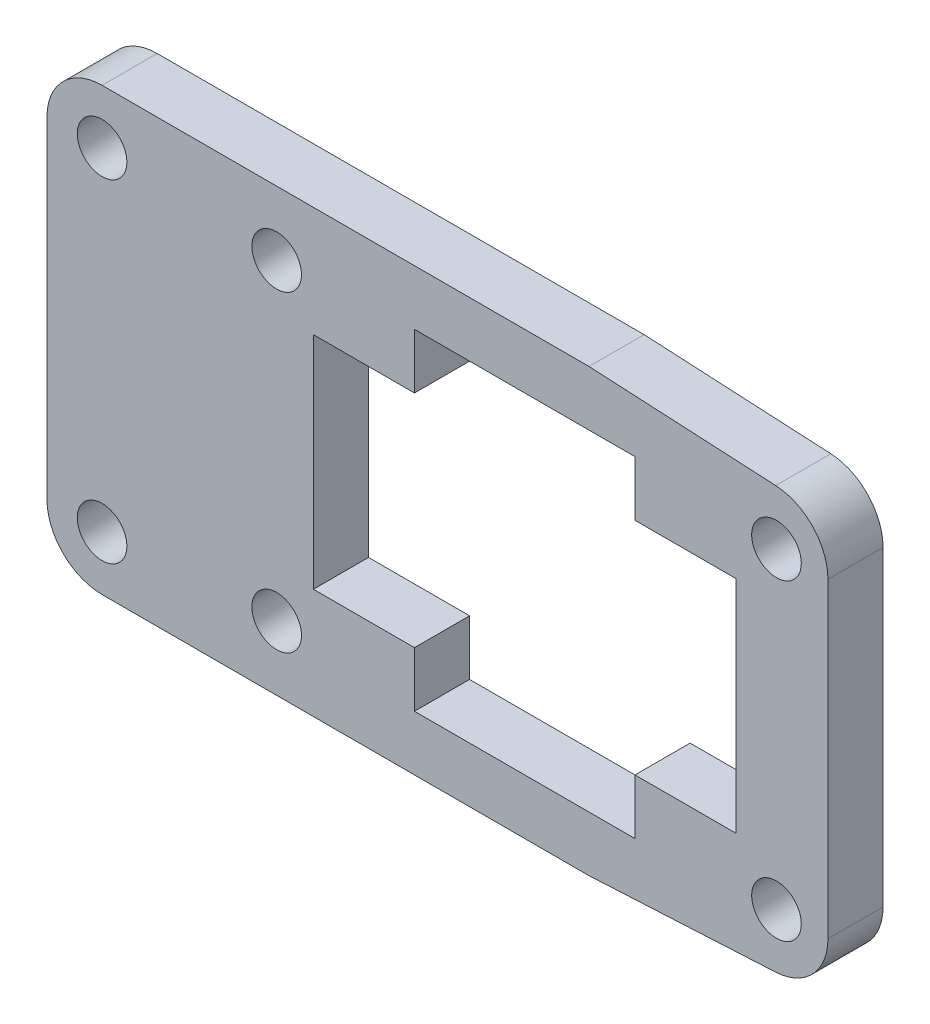
ISO-10303-21;
HEADER;
FILE_DESCRIPTION(('STEP AP214'),'2;1');
FILE_NAME('part.step','',(''),(''),'','','');
FILE_SCHEMA(('AUTOMOTIVE_DESIGN { 1 0 10303 214 1 1 1 1 }'));
ENDSEC;
DATA;
#1=APPLICATION_CONTEXT('core data for automotive mechanical design processes');
#2=APPLICATION_PROTOCOL_DEFINITION('international standard','automotive_design',2000,#1);
#3=PRODUCT_CONTEXT('',#1,'mechanical');
#4=PRODUCT('Part','Part','',(#3));
#5=PRODUCT_RELATED_PRODUCT_CATEGORY('part','',(#4));
#6=PRODUCT_DEFINITION_FORMATION('','',#4);
#7=PRODUCT_DEFINITION_CONTEXT('part definition',#1,'design');
#8=PRODUCT_DEFINITION('design','',#6,#7);
#9=PRODUCT_DEFINITION_SHAPE('','',#8);
#10=(LENGTH_UNIT() NAMED_UNIT(*) SI_UNIT(.MILLI.,.METRE.));
#11=(NAMED_UNIT(*) PLANE_ANGLE_UNIT() SI_UNIT($,.RADIAN.));
#12=(NAMED_UNIT(*) SI_UNIT($,.STERADIAN.) SOLID_ANGLE_UNIT());
#13=UNCERTAINTY_MEASURE_WITH_UNIT(LENGTH_MEASURE(1.E-05),#10,'distance_accuracy_value','');
#14=(GEOMETRIC_REPRESENTATION_CONTEXT(3) GLOBAL_UNCERTAINTY_ASSIGNED_CONTEXT((#13)) GLOBAL_UNIT_ASSIGNED_CONTEXT((#10,
#11,#12)) REPRESENTATION_CONTEXT('',''));
#15=CARTESIAN_POINT('',(0.,0.,0.));
#16=DIRECTION('',(0.,0.,1.));
#17=DIRECTION('',(1.,0.,0.));
#18=AXIS2_PLACEMENT_3D('',#15,#16,#17);
#19=CARTESIAN_POINT('',(-12.6573181561229,3.,3.));
#20=DIRECTION('',(0.,0.,-1.));
#21=DIRECTION('',(-1.,0.,0.));
#22=AXIS2_PLACEMENT_3D('',#19,#20,#21);
#23=CYLINDRICAL_SURFACE('',#22,3.);
#24=CARTESIAN_POINT('',(-12.6573181561229,3.,0.));
#25=DIRECTION('',(0.,0.,-1.));
#26=DIRECTION('',(-1.,0.,0.));
#27=AXIS2_PLACEMENT_3D('',#24,#25,#26);
#28=CIRCLE('',#27,3.);
#29=CARTESIAN_POINT('',(-12.6573181561229,0.,0.));
#30=VERTEX_POINT('',#29);
#31=CARTESIAN_POINT('',(-15.6573181561229,3.,0.));
#32=VERTEX_POINT('',#31);
#33=EDGE_CURVE('E306',#30,#32,#28,.T.);
#34=ORIENTED_EDGE('',*,*,#33,.F.);
#35=DIRECTION('',(0.,0.,-1.));
#36=VECTOR('',#35,1.);
#37=CARTESIAN_POINT('',(-12.6573181561229,0.,3.));
#38=LINE('',#37,#36);
#39=CARTESIAN_POINT('',(-12.6573181561229,0.,3.));
#40=VERTEX_POINT('',#39);
#41=EDGE_CURVE('E11',#40,#30,#38,.T.);
#42=ORIENTED_EDGE('',*,*,#41,.F.);
#43=CARTESIAN_POINT('',(-12.6573181561229,3.,3.));
#44=DIRECTION('',(0.,0.,-1.));
#45=DIRECTION('',(-1.,0.,0.));
#46=AXIS2_PLACEMENT_3D('',#43,#44,#45);
#47=CIRCLE('',#46,3.);
#48=CARTESIAN_POINT('',(-15.6573181561229,3.,3.));
#49=VERTEX_POINT('',#48);
#50=EDGE_CURVE('E309',#40,#49,#47,.T.);
#51=ORIENTED_EDGE('',*,*,#50,.T.);
#52=DIRECTION('',(0.,0.,-1.));
#53=VECTOR('',#52,1.);
#54=CARTESIAN_POINT('',(-15.6573181561229,3.,3.));
#55=LINE('',#54,#53);
#56=EDGE_CURVE('E40',#49,#32,#55,.T.);
#57=ORIENTED_EDGE('',*,*,#56,.T.);
#58=EDGE_LOOP('',(#34,#42,#51,#57));
#59=FACE_BOUND('',#58,.T.);
#60=ADVANCED_FACE('F37',(#59),#23,.T.);
#61=CARTESIAN_POINT('',(13.8436818438771,0.,3.));
#62=DIRECTION('',(0.,-1.,0.));
#63=DIRECTION('',(1.,0.,0.));
#64=AXIS2_PLACEMENT_3D('',#61,#62,#63);
#65=PLANE('',#64);
#66=DIRECTION('',(-1.,0.,0.));
#67=VECTOR('',#66,1.);
#68=CARTESIAN_POINT('',(13.8436818438771,0.,0.));
#69=LINE('',#68,#67);
#70=CARTESIAN_POINT('',(13.8436818438771,0.,0.));
#71=VERTEX_POINT('',#70);
#72=EDGE_CURVE('E313',#71,#30,#69,.T.);
#73=ORIENTED_EDGE('',*,*,#72,.F.);
#74=DIRECTION('',(0.,0.,-1.));
#75=VECTOR('',#74,1.);
#76=CARTESIAN_POINT('',(13.8436818438771,0.,3.));
#77=LINE('',#76,#75);
#78=CARTESIAN_POINT('',(13.8436818438771,0.,3.));
#79=VERTEX_POINT('',#78);
#80=EDGE_CURVE('E45',#79,#71,#77,.T.);
#81=ORIENTED_EDGE('',*,*,#80,.F.);
#82=DIRECTION('',(-1.,0.,0.));
#83=VECTOR('',#82,1.);
#84=CARTESIAN_POINT('',(13.8436818438771,0.,3.));
#85=LINE('',#84,#83);
#86=EDGE_CURVE('E337',#79,#40,#85,.T.);
#87=ORIENTED_EDGE('',*,*,#86,.T.);
#88=ORIENTED_EDGE('',*,*,#41,.T.);
#89=EDGE_LOOP('',(#73,#81,#87,#88));
#90=FACE_BOUND('',#89,.T.);
#91=ADVANCED_FACE('F394',(#90),#65,.T.);
#92=CARTESIAN_POINT('',(24.0013861888821,0.533010722706151,3.));
#93=DIRECTION('',(0.0524014483350332,-0.998626100306011,0.));
#94=DIRECTION('',(0.998626100306011,0.0524014483350332,0.));
#95=AXIS2_PLACEMENT_3D('',#92,#93,#94);
#96=PLANE('',#95);
#97=DIRECTION('',(-0.998626100306011,-0.0524014483350332,0.));
#98=VECTOR('',#97,1.);
#99=CARTESIAN_POINT('',(24.0013861888821,0.533010722706151,0.));
#100=LINE('',#99,#98);
#101=CARTESIAN_POINT('',(24.0013861888821,0.533010722706151,0.));
#102=VERTEX_POINT('',#101);
#103=EDGE_CURVE('E363',#102,#71,#100,.T.);
#104=ORIENTED_EDGE('',*,*,#103,.F.);
#105=DIRECTION('',(0.,0.,-1.));
#106=VECTOR('',#105,1.);
#107=CARTESIAN_POINT('',(24.0013861888821,0.533010722706151,3.));
#108=LINE('',#107,#106);
#109=CARTESIAN_POINT('',(24.0013861888821,0.533010722706151,3.));
#110=VERTEX_POINT('',#109);
#111=EDGE_CURVE('E369',#110,#102,#108,.T.);
#112=ORIENTED_EDGE('',*,*,#111,.F.);
#113=DIRECTION('',(-0.998626100306011,-0.0524014483350332,0.));
#114=VECTOR('',#113,1.);
#115=CARTESIAN_POINT('',(24.0013861888821,0.533010722706151,3.));
#116=LINE('',#115,#114);
#117=EDGE_CURVE('E334',#110,#79,#116,.T.);
#118=ORIENTED_EDGE('',*,*,#117,.T.);
#119=ORIENTED_EDGE('',*,*,#80,.T.);
#120=EDGE_LOOP('',(#104,#112,#118,#119));
#121=FACE_BOUND('',#120,.T.);
#122=ADVANCED_FACE('F422',(#121),#96,.T.);
#123=CARTESIAN_POINT('',(23.844181843877,3.52888902362418,3.));
#124=DIRECTION('',(0.,0.,-1.));
#125=DIRECTION('',(-1.,0.,0.));
#126=AXIS2_PLACEMENT_3D('',#123,#124,#125);
#127=CYLINDRICAL_SURFACE('',#126,3.);
#128=CARTESIAN_POINT('',(23.844181843877,3.52888902362418,0.));
#129=DIRECTION('',(0.,0.,-1.));
#130=DIRECTION('',(-1.,0.,0.));
#131=AXIS2_PLACEMENT_3D('',#128,#129,#130);
#132=CIRCLE('',#131,3.);
#133=CARTESIAN_POINT('',(26.844181843877,3.52888902362418,0.));
#134=VERTEX_POINT('',#133);
#135=EDGE_CURVE('E360',#134,#102,#132,.T.);
#136=ORIENTED_EDGE('',*,*,#135,.F.);
#137=DIRECTION('',(0.,0.,-1.));
#138=VECTOR('',#137,1.);
#139=CARTESIAN_POINT('',(26.844181843877,3.52888902362418,3.));
#140=LINE('',#139,#138);
#141=CARTESIAN_POINT('',(26.844181843877,3.52888902362418,3.));
#142=VERTEX_POINT('',#141);
#143=EDGE_CURVE('E371',#142,#134,#140,.T.);
#144=ORIENTED_EDGE('',*,*,#143,.F.);
#145=CARTESIAN_POINT('',(23.844181843877,3.52888902362418,3.));
#146=DIRECTION('',(0.,0.,-1.));
#147=DIRECTION('',(-1.,0.,0.));
#148=AXIS2_PLACEMENT_3D('',#145,#146,#147);
#149=CIRCLE('',#148,3.);
#150=EDGE_CURVE('E331',#142,#110,#149,.T.);
#151=ORIENTED_EDGE('',*,*,#150,.T.);
#152=ORIENTED_EDGE('',*,*,#111,.T.);
#153=EDGE_LOOP('',(#136,#144,#151,#152));
#154=FACE_BOUND('',#153,.T.);
#155=ADVANCED_FACE('F420',(#154),#127,.T.);
#156=CARTESIAN_POINT('',(26.844181843877,20.4719109820149,3.));
#157=DIRECTION('',(1.,0.,0.));
#158=DIRECTION('',(0.,1.,0.));
#159=AXIS2_PLACEMENT_3D('',#156,#157,#158);
#160=PLANE('',#159);
#161=DIRECTION('',(0.,-1.,0.));
#162=VECTOR('',#161,1.);
#163=CARTESIAN_POINT('',(26.844181843877,20.4719109820149,0.));
#164=LINE('',#163,#162);
#165=CARTESIAN_POINT('',(26.844181843877,20.4719109820149,0.));
#166=VERTEX_POINT('',#165);
#167=EDGE_CURVE('E357',#166,#134,#164,.T.);
#168=ORIENTED_EDGE('',*,*,#167,.F.);
#169=DIRECTION('',(0.,0.,-1.));
#170=VECTOR('',#169,1.);
#171=CARTESIAN_POINT('',(26.844181843877,20.4719109820149,3.));
#172=LINE('',#171,#170);
#173=CARTESIAN_POINT('',(26.844181843877,20.4719109820149,3.));
#174=VERTEX_POINT('',#173);
#175=EDGE_CURVE('E373',#174,#166,#172,.T.);
#176=ORIENTED_EDGE('',*,*,#175,.F.);
#177=DIRECTION('',(0.,-1.,0.));
#178=VECTOR('',#177,1.);
#179=CARTESIAN_POINT('',(26.844181843877,20.4719109820149,3.));
#180=LINE('',#179,#178);
#181=EDGE_CURVE('E328',#174,#142,#180,.T.);
#182=ORIENTED_EDGE('',*,*,#181,.T.);
#183=ORIENTED_EDGE('',*,*,#143,.T.);
#184=EDGE_LOOP('',(#168,#176,#182,#183));
#185=FACE_BOUND('',#184,.T.);
#186=ADVANCED_FACE('F416',(#185),#160,.T.);
#187=CARTESIAN_POINT('',(23.844181843877,20.4719109820149,3.));
#188=DIRECTION('',(0.,0.,-1.));
#189=DIRECTION('',(-1.,0.,0.));
#190=AXIS2_PLACEMENT_3D('',#187,#188,#189);
#191=CYLINDRICAL_SURFACE('',#190,2.99999999999996);
#192=CARTESIAN_POINT('',(23.844181843877,20.4719109820149,0.));
#193=DIRECTION('',(0.,0.,-1.));
#194=DIRECTION('',(-1.,0.,0.));
#195=AXIS2_PLACEMENT_3D('',#192,#193,#194);
#196=CIRCLE('',#195,2.99999999999996);
#197=CARTESIAN_POINT('',(24.0010920540107,23.4678047027526,0.));
#198=VERTEX_POINT('',#197);
#199=EDGE_CURVE('E354',#198,#166,#196,.T.);
#200=ORIENTED_EDGE('',*,*,#199,.F.);
#201=DIRECTION('',(0.,0.,-1.));
#202=VECTOR('',#201,1.);
#203=CARTESIAN_POINT('',(24.0010920540107,23.4678047027526,3.));
#204=LINE('',#203,#202);
#205=CARTESIAN_POINT('',(24.0010920540107,23.4678047027526,3.));
#206=VERTEX_POINT('',#205);
#207=EDGE_CURVE('E375',#206,#198,#204,.T.);
#208=ORIENTED_EDGE('',*,*,#207,.F.);
#209=CARTESIAN_POINT('',(23.844181843877,20.4719109820149,3.));
#210=DIRECTION('',(0.,0.,-1.));
#211=DIRECTION('',(-1.,0.,0.));
#212=AXIS2_PLACEMENT_3D('',#209,#210,#211);
#213=CIRCLE('',#212,2.99999999999996);
#214=EDGE_CURVE('E325',#206,#174,#213,.T.);
#215=ORIENTED_EDGE('',*,*,#214,.T.);
#216=ORIENTED_EDGE('',*,*,#175,.T.);
#217=EDGE_LOOP('',(#200,#208,#215,#216));
#218=FACE_BOUND('',#217,.T.);
#219=ADVANCED_FACE('F412',(#218),#191,.T.);
#220=CARTESIAN_POINT('',(13.8436818438771,23.9998,3.));
#221=DIRECTION('',(0.0523034033778794,0.998631240245913,0.));
#222=DIRECTION('',(-0.998631240245913,0.0523034033778794,0.));
#223=AXIS2_PLACEMENT_3D('',#220,#221,#222);
#224=PLANE('',#223);
#225=DIRECTION('',(0.998631240245913,-0.0523034033778794,0.));
#226=VECTOR('',#225,1.);
#227=CARTESIAN_POINT('',(13.8436818438771,23.9998,0.));
#228=LINE('',#227,#226);
#229=CARTESIAN_POINT('',(13.8436818438771,23.9998,0.));
#230=VERTEX_POINT('',#229);
#231=EDGE_CURVE('E351',#230,#198,#228,.T.);
#232=ORIENTED_EDGE('',*,*,#231,.F.);
#233=DIRECTION('',(0.,0.,-1.));
#234=VECTOR('',#233,1.);
#235=CARTESIAN_POINT('',(13.8436818438771,23.9998,3.));
#236=LINE('',#235,#234);
#237=CARTESIAN_POINT('',(13.8436818438771,23.9998,3.));
#238=VERTEX_POINT('',#237);
#239=EDGE_CURVE('E377',#238,#230,#236,.T.);
#240=ORIENTED_EDGE('',*,*,#239,.F.);
#241=DIRECTION('',(0.998631240245913,-0.0523034033778794,0.));
#242=VECTOR('',#241,1.);
#243=CARTESIAN_POINT('',(13.8436818438771,23.9998,3.));
#244=LINE('',#243,#242);
#245=EDGE_CURVE('E322',#238,#206,#244,.T.);
#246=ORIENTED_EDGE('',*,*,#245,.T.);
#247=ORIENTED_EDGE('',*,*,#207,.T.);
#248=EDGE_LOOP('',(#232,#240,#246,#247));
#249=FACE_BOUND('',#248,.T.);
#250=ADVANCED_FACE('F408',(#249),#224,.T.);
#251=CARTESIAN_POINT('',(-12.6573181561229,23.9998,3.));
#252=DIRECTION('',(0.,1.,0.));
#253=DIRECTION('',(0.,0.,1.));
#254=AXIS2_PLACEMENT_3D('',#251,#252,#253);
#255=PLANE('',#254);
#256=DIRECTION('',(1.,0.,0.));
#257=VECTOR('',#256,1.);
#258=CARTESIAN_POINT('',(-12.6573181561229,23.9998,0.));
#259=LINE('',#258,#257);
#260=CARTESIAN_POINT('',(-12.6573181561229,23.9998,0.));
#261=VERTEX_POINT('',#260);
#262=EDGE_CURVE('E348',#261,#230,#259,.T.);
#263=ORIENTED_EDGE('',*,*,#262,.F.);
#264=DIRECTION('',(0.,0.,-1.));
#265=VECTOR('',#264,1.);
#266=CARTESIAN_POINT('',(-12.6573181561229,23.9998,3.));
#267=LINE('',#266,#265);
#268=CARTESIAN_POINT('',(-12.6573181561229,23.9998,3.));
#269=VERTEX_POINT('',#268);
#270=EDGE_CURVE('E379',#269,#261,#267,.T.);
#271=ORIENTED_EDGE('',*,*,#270,.F.);
#272=DIRECTION('',(1.,0.,0.));
#273=VECTOR('',#272,1.);
#274=CARTESIAN_POINT('',(-12.6573181561229,23.9998,3.));
#275=LINE('',#274,#273);
#276=EDGE_CURVE('E319',#269,#238,#275,.T.);
#277=ORIENTED_EDGE('',*,*,#276,.T.);
#278=ORIENTED_EDGE('',*,*,#239,.T.);
#279=EDGE_LOOP('',(#263,#271,#277,#278));
#280=FACE_BOUND('',#279,.T.);
#281=ADVANCED_FACE('F406',(#280),#255,.T.);
#282=CARTESIAN_POINT('',(-12.6573181561229,20.9998,3.));
#283=DIRECTION('',(0.,0.,-1.));
#284=DIRECTION('',(-1.,0.,0.));
#285=AXIS2_PLACEMENT_3D('',#282,#283,#284);
#286=CYLINDRICAL_SURFACE('',#285,3.);
#287=CARTESIAN_POINT('',(-12.6573181561229,20.9998,0.));
#288=DIRECTION('',(0.,0.,-1.));
#289=DIRECTION('',(-1.,0.,0.));
#290=AXIS2_PLACEMENT_3D('',#287,#288,#289);
#291=CIRCLE('',#290,3.);
#292=CARTESIAN_POINT('',(-15.6573181561229,20.9998,0.));
#293=VERTEX_POINT('',#292);
#294=EDGE_CURVE('E345',#293,#261,#291,.T.);
#295=ORIENTED_EDGE('',*,*,#294,.F.);
#296=DIRECTION('',(0.,0.,-1.));
#297=VECTOR('',#296,1.);
#298=CARTESIAN_POINT('',(-15.6573181561229,20.9998,3.));
#299=LINE('',#298,#297);
#300=CARTESIAN_POINT('',(-15.6573181561229,20.9998,3.));
#301=VERTEX_POINT('',#300);
#302=EDGE_CURVE('E380',#301,#293,#299,.T.);
#303=ORIENTED_EDGE('',*,*,#302,.F.);
#304=CARTESIAN_POINT('',(-12.6573181561229,20.9998,3.));
#305=DIRECTION('',(0.,0.,-1.));
#306=DIRECTION('',(-1.,0.,0.));
#307=AXIS2_PLACEMENT_3D('',#304,#305,#306);
#308=CIRCLE('',#307,3.);
#309=EDGE_CURVE('E316',#301,#269,#308,.T.);
#310=ORIENTED_EDGE('',*,*,#309,.T.);
#311=ORIENTED_EDGE('',*,*,#270,.T.);
#312=EDGE_LOOP('',(#295,#303,#310,#311));
#313=FACE_BOUND('',#312,.T.);
#314=ADVANCED_FACE('F402',(#313),#286,.T.);
#315=CARTESIAN_POINT('',(-15.6573181561229,3.,3.));
#316=DIRECTION('',(-1.,0.,0.));
#317=DIRECTION('',(0.,0.,1.));
#318=AXIS2_PLACEMENT_3D('',#315,#316,#317);
#319=PLANE('',#318);
#320=DIRECTION('',(0.,1.,0.));
#321=VECTOR('',#320,1.);
#322=CARTESIAN_POINT('',(-15.6573181561229,3.,0.));
#323=LINE('',#322,#321);
#324=EDGE_CURVE('E342',#32,#293,#323,.T.);
#325=ORIENTED_EDGE('',*,*,#324,.F.);
#326=ORIENTED_EDGE('',*,*,#56,.F.);
#327=DIRECTION('',(0.,1.,0.));
#328=VECTOR('',#327,1.);
#329=CARTESIAN_POINT('',(-15.6573181561229,3.,3.));
#330=LINE('',#329,#328);
#331=EDGE_CURVE('E312',#49,#301,#330,.T.);
#332=ORIENTED_EDGE('',*,*,#331,.T.);
#333=ORIENTED_EDGE('',*,*,#302,.T.);
#334=EDGE_LOOP('',(#325,#326,#332,#333));
#335=FACE_BOUND('',#334,.T.);
#336=ADVANCED_FACE('F388',(#335),#319,.T.);
#337=CARTESIAN_POINT('',(-12.6573181561229,3.,3.));
#338=DIRECTION('',(0.,0.,-1.));
#339=DIRECTION('',(-1.,0.,0.));
#340=AXIS2_PLACEMENT_3D('',#337,#338,#339);
#341=PLANE('',#340);
#342=CARTESIAN_POINT('',(-12.6574681561229,21.049,3.));
#343=DIRECTION('',(0.,0.,-1.));
#344=DIRECTION('',(1.,0.,0.));
#345=AXIS2_PLACEMENT_3D('',#342,#343,#344);
#346=CIRCLE('',#345,1.35);
#347=CARTESIAN_POINT('',(-11.3074681561229,21.049,3.));
#348=VERTEX_POINT('',#347);
#349=EDGE_CURVE('E695',#348,#348,#346,.T.);
#350=ORIENTED_EDGE('',*,*,#349,.T.);
#351=EDGE_LOOP('',(#350));
#352=FACE_BOUND('',#351,.T.);
#353=CARTESIAN_POINT('',(-12.657468156123,2.95,3.));
#354=DIRECTION('',(0.,0.,-1.));
#355=DIRECTION('',(1.,0.,0.));
#356=AXIS2_PLACEMENT_3D('',#353,#354,#355);
#357=CIRCLE('',#356,1.35);
#358=CARTESIAN_POINT('',(-11.307468156123,2.95,3.));
#359=VERTEX_POINT('',#358);
#360=EDGE_CURVE('E703',#359,#359,#357,.T.);
#361=ORIENTED_EDGE('',*,*,#360,.T.);
#362=EDGE_LOOP('',(#361));
#363=FACE_BOUND('',#362,.T.);
#364=CARTESIAN_POINT('',(-3.15601815612294,3.50114834928544,3.));
#365=DIRECTION('',(0.,0.,-1.));
#366=DIRECTION('',(1.,0.,0.));
#367=AXIS2_PLACEMENT_3D('',#364,#365,#366);
#368=CIRCLE('',#367,1.35);
#369=CARTESIAN_POINT('',(-1.80601815612294,3.50114834928544,3.));
#370=VERTEX_POINT('',#369);
#371=EDGE_CURVE('E241',#370,#370,#368,.T.);
#372=ORIENTED_EDGE('',*,*,#371,.T.);
#373=EDGE_LOOP('',(#372));
#374=FACE_BOUND('',#373,.T.);
#375=DIRECTION('',(0.,1.,0.));
#376=VECTOR('',#375,1.);
#377=CARTESIAN_POINT('',(4.34338184387702,20.9998,3.));
#378=LINE('',#377,#376);
#379=CARTESIAN_POINT('',(4.34338184387702,17.9998,3.));
#380=VERTEX_POINT('',#379);
#381=CARTESIAN_POINT('',(4.34338184387702,20.9998,3.));
#382=VERTEX_POINT('',#381);
#383=EDGE_CURVE('E194',#380,#382,#378,.T.);
#384=ORIENTED_EDGE('',*,*,#383,.T.);
#385=DIRECTION('',(1.,0.,0.));
#386=VECTOR('',#385,1.);
#387=CARTESIAN_POINT('',(16.3433818438771,20.9998,3.));
#388=LINE('',#387,#386);
#389=CARTESIAN_POINT('',(16.3433818438771,20.9998,3.));
#390=VERTEX_POINT('',#389);
#391=EDGE_CURVE('E188',#382,#390,#388,.T.);
#392=ORIENTED_EDGE('',*,*,#391,.T.);
#393=DIRECTION('',(0.,-1.,0.));
#394=VECTOR('',#393,1.);
#395=CARTESIAN_POINT('',(16.3433818438771,17.9998,3.));
#396=LINE('',#395,#394);
#397=CARTESIAN_POINT('',(16.3433818438771,17.9998,3.));
#398=VERTEX_POINT('',#397);
#399=EDGE_CURVE('E197',#390,#398,#396,.T.);
#400=ORIENTED_EDGE('',*,*,#399,.T.);
#401=DIRECTION('',(1.,0.,0.));
#402=VECTOR('',#401,1.);
#403=CARTESIAN_POINT('',(21.843181843877,17.9998,3.));
#404=LINE('',#403,#402);
#405=CARTESIAN_POINT('',(21.843181843877,17.9998,3.));
#406=VERTEX_POINT('',#405);
#407=EDGE_CURVE('E53',#398,#406,#404,.T.);
#408=ORIENTED_EDGE('',*,*,#407,.T.);
#409=DIRECTION('',(0.,-1.,0.));
#410=VECTOR('',#409,1.);
#411=CARTESIAN_POINT('',(21.843181843877,6.,3.));
#412=LINE('',#411,#410);
#413=CARTESIAN_POINT('',(21.843181843877,6.,3.));
#414=VERTEX_POINT('',#413);
#415=EDGE_CURVE('E215',#406,#414,#412,.T.);
#416=ORIENTED_EDGE('',*,*,#415,.T.);
#417=DIRECTION('',(-1.,0.,0.));
#418=VECTOR('',#417,1.);
#419=CARTESIAN_POINT('',(16.3433818438771,6.,3.));
#420=LINE('',#419,#418);
#421=CARTESIAN_POINT('',(16.3433818438771,6.,3.));
#422=VERTEX_POINT('',#421);
#423=EDGE_CURVE('E218',#414,#422,#420,.T.);
#424=ORIENTED_EDGE('',*,*,#423,.T.);
#425=DIRECTION('',(0.,-1.,0.));
#426=VECTOR('',#425,1.);
#427=CARTESIAN_POINT('',(16.3433818438771,3.,3.));
#428=LINE('',#427,#426);
#429=CARTESIAN_POINT('',(16.3433818438771,3.,3.));
#430=VERTEX_POINT('',#429);
#431=EDGE_CURVE('E221',#422,#430,#428,.T.);
#432=ORIENTED_EDGE('',*,*,#431,.T.);
#433=DIRECTION('',(-1.,0.,0.));
#434=VECTOR('',#433,1.);
#435=CARTESIAN_POINT('',(4.34338184387701,3.,3.));
#436=LINE('',#435,#434);
#437=CARTESIAN_POINT('',(4.34338184387701,3.,3.));
#438=VERTEX_POINT('',#437);
#439=EDGE_CURVE('E224',#430,#438,#436,.T.);
#440=ORIENTED_EDGE('',*,*,#439,.T.);
#441=DIRECTION('',(0.,1.,0.));
#442=VECTOR('',#441,1.);
#443=CARTESIAN_POINT('',(4.34338184387701,6.,3.));
#444=LINE('',#443,#442);
#445=CARTESIAN_POINT('',(4.34338184387701,6.,3.));
#446=VERTEX_POINT('',#445);
#447=EDGE_CURVE('E227',#438,#446,#444,.T.);
#448=ORIENTED_EDGE('',*,*,#447,.T.);
#449=DIRECTION('',(-1.,0.,0.));
#450=VECTOR('',#449,1.);
#451=CARTESIAN_POINT('',(-1.15651815612298,6.,3.));
#452=LINE('',#451,#450);
#453=CARTESIAN_POINT('',(-1.15651815612298,6.,3.));
#454=VERTEX_POINT('',#453);
#455=EDGE_CURVE('E230',#446,#454,#452,.T.);
#456=ORIENTED_EDGE('',*,*,#455,.T.);
#457=DIRECTION('',(0.,1.,0.));
#458=VECTOR('',#457,1.);
#459=CARTESIAN_POINT('',(-1.15651815612298,17.9998,3.));
#460=LINE('',#459,#458);
#461=CARTESIAN_POINT('',(-1.15651815612298,17.9998,3.));
#462=VERTEX_POINT('',#461);
#463=EDGE_CURVE('E233',#454,#462,#460,.T.);
#464=ORIENTED_EDGE('',*,*,#463,.T.);
#465=DIRECTION('',(1.,0.,0.));
#466=VECTOR('',#465,1.);
#467=CARTESIAN_POINT('',(4.34338184387702,17.9998,3.));
#468=LINE('',#467,#466);
#469=EDGE_CURVE('E236',#462,#380,#468,.T.);
#470=ORIENTED_EDGE('',*,*,#469,.T.);
#471=EDGE_LOOP('',(#384,#392,#400,#408,#416,#424,#432,#440,#448,#456,#464,#470));
#472=FACE_BOUND('',#471,.T.);
#473=CARTESIAN_POINT('',(-3.15601815612294,20.4983516507146,3.));
#474=DIRECTION('',(0.,0.,-1.));
#475=DIRECTION('',(1.,0.,0.));
#476=AXIS2_PLACEMENT_3D('',#473,#474,#475);
#477=CIRCLE('',#476,1.35);
#478=CARTESIAN_POINT('',(-1.80601815612294,20.4983516507146,3.));
#479=VERTEX_POINT('',#478);
#480=EDGE_CURVE('E291',#479,#479,#477,.T.);
#481=ORIENTED_EDGE('',*,*,#480,.T.);
#482=EDGE_LOOP('',(#481));
#483=FACE_BOUND('',#482,.T.);
#484=CARTESIAN_POINT('',(24.044031843877,20.4983516507146,3.));
#485=DIRECTION('',(0.,0.,-1.));
#486=DIRECTION('',(1.,0.,0.));
#487=AXIS2_PLACEMENT_3D('',#484,#485,#486);
#488=CIRCLE('',#487,1.35);
#489=CARTESIAN_POINT('',(25.394031843877,20.4983516507146,3.));
#490=VERTEX_POINT('',#489);
#491=EDGE_CURVE('E297',#490,#490,#488,.T.);
#492=ORIENTED_EDGE('',*,*,#491,.T.);
#493=EDGE_LOOP('',(#492));
#494=FACE_BOUND('',#493,.T.);
#495=CARTESIAN_POINT('',(24.044031843877,3.50114834928544,3.));
#496=DIRECTION('',(0.,0.,-1.));
#497=DIRECTION('',(1.,0.,0.));
#498=AXIS2_PLACEMENT_3D('',#495,#496,#497);
#499=CIRCLE('',#498,1.35);
#500=CARTESIAN_POINT('',(25.394031843877,3.50114834928544,3.));
#501=VERTEX_POINT('',#500);
#502=EDGE_CURVE('E303',#501,#501,#499,.T.);
#503=ORIENTED_EDGE('',*,*,#502,.T.);
#504=EDGE_LOOP('',(#503));
#505=FACE_BOUND('',#504,.T.);
#506=ORIENTED_EDGE('',*,*,#50,.F.);
#507=ORIENTED_EDGE('',*,*,#86,.F.);
#508=ORIENTED_EDGE('',*,*,#117,.F.);
#509=ORIENTED_EDGE('',*,*,#150,.F.);
#510=ORIENTED_EDGE('',*,*,#181,.F.);
#511=ORIENTED_EDGE('',*,*,#214,.F.);
#512=ORIENTED_EDGE('',*,*,#245,.F.);
#513=ORIENTED_EDGE('',*,*,#276,.F.);
#514=ORIENTED_EDGE('',*,*,#309,.F.);
#515=ORIENTED_EDGE('',*,*,#331,.F.);
#516=EDGE_LOOP('',(#506,#507,#508,#509,#510,#511,#512,#513,#514,#515));
#517=FACE_BOUND('',#516,.T.);
#518=ADVANCED_FACE('F201',(#352,#363,#374,#472,#483,#494,#505,#517),#341,.F.);
#519=CARTESIAN_POINT('',(-12.6573181561229,3.,0.));
#520=DIRECTION('',(0.,0.,-1.));
#521=DIRECTION('',(-1.,0.,0.));
#522=AXIS2_PLACEMENT_3D('',#519,#520,#521);
#523=PLANE('',#522);
#524=CARTESIAN_POINT('',(-12.6574681561229,21.049,0.));
#525=DIRECTION('',(0.,0.,-1.));
#526=DIRECTION('',(1.,0.,0.));
#527=AXIS2_PLACEMENT_3D('',#524,#525,#526);
#528=CIRCLE('',#527,1.35);
#529=CARTESIAN_POINT('',(-11.3074681561229,21.049,0.));
#530=VERTEX_POINT('',#529);
#531=EDGE_CURVE('E698',#530,#530,#528,.T.);
#532=ORIENTED_EDGE('',*,*,#531,.F.);
#533=EDGE_LOOP('',(#532));
#534=FACE_BOUND('',#533,.T.);
#535=CARTESIAN_POINT('',(-12.657468156123,2.95,0.));
#536=DIRECTION('',(0.,0.,-1.));
#537=DIRECTION('',(1.,0.,0.));
#538=AXIS2_PLACEMENT_3D('',#535,#536,#537);
#539=CIRCLE('',#538,1.35);
#540=CARTESIAN_POINT('',(-11.307468156123,2.95,0.));
#541=VERTEX_POINT('',#540);
#542=EDGE_CURVE('E700',#541,#541,#539,.T.);
#543=ORIENTED_EDGE('',*,*,#542,.F.);
#544=EDGE_LOOP('',(#543));
#545=FACE_BOUND('',#544,.T.);
#546=CARTESIAN_POINT('',(-3.15601815612294,3.50114834928544,0.));
#547=DIRECTION('',(0.,0.,-1.));
#548=DIRECTION('',(1.,0.,0.));
#549=AXIS2_PLACEMENT_3D('',#546,#547,#548);
#550=CIRCLE('',#549,1.35);
#551=CARTESIAN_POINT('',(-1.80601815612294,3.50114834928544,0.));
#552=VERTEX_POINT('',#551);
#553=EDGE_CURVE('E211',#552,#552,#550,.T.);
#554=ORIENTED_EDGE('',*,*,#553,.F.);
#555=EDGE_LOOP('',(#554));
#556=FACE_BOUND('',#555,.T.);
#557=DIRECTION('',(1.,0.,0.));
#558=VECTOR('',#557,1.);
#559=CARTESIAN_POINT('',(16.3433818438771,20.9998,0.));
#560=LINE('',#559,#558);
#561=CARTESIAN_POINT('',(4.34338184387702,20.9998,0.));
#562=VERTEX_POINT('',#561);
#563=CARTESIAN_POINT('',(16.3433818438771,20.9998,0.));
#564=VERTEX_POINT('',#563);
#565=EDGE_CURVE('E61',#562,#564,#560,.T.);
#566=ORIENTED_EDGE('',*,*,#565,.F.);
#567=DIRECTION('',(0.,1.,0.));
#568=VECTOR('',#567,1.);
#569=CARTESIAN_POINT('',(4.34338184387702,20.9998,0.));
#570=LINE('',#569,#568);
#571=CARTESIAN_POINT('',(4.34338184387702,17.9998,0.));
#572=VERTEX_POINT('',#571);
#573=EDGE_CURVE('E205',#572,#562,#570,.T.);
#574=ORIENTED_EDGE('',*,*,#573,.F.);
#575=DIRECTION('',(1.,0.,0.));
#576=VECTOR('',#575,1.);
#577=CARTESIAN_POINT('',(4.34338184387702,17.9998,0.));
#578=LINE('',#577,#576);
#579=CARTESIAN_POINT('',(-1.15651815612298,17.9998,0.));
#580=VERTEX_POINT('',#579);
#581=EDGE_CURVE('E208',#580,#572,#578,.T.);
#582=ORIENTED_EDGE('',*,*,#581,.F.);
#583=DIRECTION('',(0.,1.,0.));
#584=VECTOR('',#583,1.);
#585=CARTESIAN_POINT('',(-1.15651815612298,17.9998,0.));
#586=LINE('',#585,#584);
#587=CARTESIAN_POINT('',(-1.15651815612298,6.,0.));
#588=VERTEX_POINT('',#587);
#589=EDGE_CURVE('E264',#588,#580,#586,.T.);
#590=ORIENTED_EDGE('',*,*,#589,.F.);
#591=DIRECTION('',(-1.,0.,0.));
#592=VECTOR('',#591,1.);
#593=CARTESIAN_POINT('',(-1.15651815612298,6.,0.));
#594=LINE('',#593,#592);
#595=CARTESIAN_POINT('',(4.34338184387701,6.,0.));
#596=VERTEX_POINT('',#595);
#597=EDGE_CURVE('E261',#596,#588,#594,.T.);
#598=ORIENTED_EDGE('',*,*,#597,.F.);
#599=DIRECTION('',(0.,1.,0.));
#600=VECTOR('',#599,1.);
#601=CARTESIAN_POINT('',(4.34338184387701,6.,0.));
#602=LINE('',#601,#600);
#603=CARTESIAN_POINT('',(4.34338184387701,3.,0.));
#604=VERTEX_POINT('',#603);
#605=EDGE_CURVE('E258',#604,#596,#602,.T.);
#606=ORIENTED_EDGE('',*,*,#605,.F.);
#607=DIRECTION('',(-1.,0.,0.));
#608=VECTOR('',#607,1.);
#609=CARTESIAN_POINT('',(4.34338184387701,3.,0.));
#610=LINE('',#609,#608);
#611=CARTESIAN_POINT('',(16.3433818438771,3.,0.));
#612=VERTEX_POINT('',#611);
#613=EDGE_CURVE('E255',#612,#604,#610,.T.);
#614=ORIENTED_EDGE('',*,*,#613,.F.);
#615=DIRECTION('',(0.,-1.,0.));
#616=VECTOR('',#615,1.);
#617=CARTESIAN_POINT('',(16.3433818438771,3.,0.));
#618=LINE('',#617,#616);
#619=CARTESIAN_POINT('',(16.3433818438771,6.,0.));
#620=VERTEX_POINT('',#619);
#621=EDGE_CURVE('E252',#620,#612,#618,.T.);
#622=ORIENTED_EDGE('',*,*,#621,.F.);
#623=DIRECTION('',(-1.,0.,0.));
#624=VECTOR('',#623,1.);
#625=CARTESIAN_POINT('',(16.3433818438771,6.,0.));
#626=LINE('',#625,#624);
#627=CARTESIAN_POINT('',(21.843181843877,6.,0.));
#628=VERTEX_POINT('',#627);
#629=EDGE_CURVE('E249',#628,#620,#626,.T.);
#630=ORIENTED_EDGE('',*,*,#629,.F.);
#631=DIRECTION('',(0.,-1.,0.));
#632=VECTOR('',#631,1.);
#633=CARTESIAN_POINT('',(21.843181843877,6.,0.));
#634=LINE('',#633,#632);
#635=CARTESIAN_POINT('',(21.843181843877,17.9998,0.));
#636=VERTEX_POINT('',#635);
#637=EDGE_CURVE('E246',#636,#628,#634,.T.);
#638=ORIENTED_EDGE('',*,*,#637,.F.);
#639=DIRECTION('',(1.,0.,0.));
#640=VECTOR('',#639,1.);
#641=CARTESIAN_POINT('',(21.843181843877,17.9998,0.));
#642=LINE('',#641,#640);
#643=CARTESIAN_POINT('',(16.3433818438771,17.9998,0.));
#644=VERTEX_POINT('',#643);
#645=EDGE_CURVE('E243',#644,#636,#642,.T.);
#646=ORIENTED_EDGE('',*,*,#645,.F.);
#647=DIRECTION('',(0.,-1.,0.));
#648=VECTOR('',#647,1.);
#649=CARTESIAN_POINT('',(16.3433818438771,17.9998,0.));
#650=LINE('',#649,#648);
#651=EDGE_CURVE('E240',#564,#644,#650,.T.);
#652=ORIENTED_EDGE('',*,*,#651,.F.);
#653=EDGE_LOOP('',(#566,#574,#582,#590,#598,#606,#614,#622,#630,#638,#646,#652));
#654=FACE_BOUND('',#653,.T.);
#655=CARTESIAN_POINT('',(-3.15601815612294,20.4983516507146,0.));
#656=DIRECTION('',(0.,0.,-1.));
#657=DIRECTION('',(1.,0.,0.));
#658=AXIS2_PLACEMENT_3D('',#655,#656,#657);
#659=CIRCLE('',#658,1.35);
#660=CARTESIAN_POINT('',(-1.80601815612294,20.4983516507146,0.));
#661=VERTEX_POINT('',#660);
#662=EDGE_CURVE('E271',#661,#661,#659,.T.);
#663=ORIENTED_EDGE('',*,*,#662,.F.);
#664=EDGE_LOOP('',(#663));
#665=FACE_BOUND('',#664,.T.);
#666=CARTESIAN_POINT('',(24.044031843877,20.4983516507146,0.));
#667=DIRECTION('',(0.,0.,-1.));
#668=DIRECTION('',(1.,0.,0.));
#669=AXIS2_PLACEMENT_3D('',#666,#667,#668);
#670=CIRCLE('',#669,1.35);
#671=CARTESIAN_POINT('',(25.394031843877,20.4983516507146,0.));
#672=VERTEX_POINT('',#671);
#673=EDGE_CURVE('E294',#672,#672,#670,.T.);
#674=ORIENTED_EDGE('',*,*,#673,.F.);
#675=EDGE_LOOP('',(#674));
#676=FACE_BOUND('',#675,.T.);
#677=CARTESIAN_POINT('',(24.044031843877,3.50114834928544,0.));
#678=DIRECTION('',(0.,0.,-1.));
#679=DIRECTION('',(1.,0.,0.));
#680=AXIS2_PLACEMENT_3D('',#677,#678,#679);
#681=CIRCLE('',#680,1.35);
#682=CARTESIAN_POINT('',(25.394031843877,3.50114834928544,0.));
#683=VERTEX_POINT('',#682);
#684=EDGE_CURVE('E300',#683,#683,#681,.T.);
#685=ORIENTED_EDGE('',*,*,#684,.F.);
#686=EDGE_LOOP('',(#685));
#687=FACE_BOUND('',#686,.T.);
#688=ORIENTED_EDGE('',*,*,#33,.T.);
#689=ORIENTED_EDGE('',*,*,#324,.T.);
#690=ORIENTED_EDGE('',*,*,#294,.T.);
#691=ORIENTED_EDGE('',*,*,#262,.T.);
#692=ORIENTED_EDGE('',*,*,#231,.T.);
#693=ORIENTED_EDGE('',*,*,#199,.T.);
#694=ORIENTED_EDGE('',*,*,#167,.T.);
#695=ORIENTED_EDGE('',*,*,#135,.T.);
#696=ORIENTED_EDGE('',*,*,#103,.T.);
#697=ORIENTED_EDGE('',*,*,#72,.T.);
#698=EDGE_LOOP('',(#688,#689,#690,#691,#692,#693,#694,#695,#696,#697));
#699=FACE_BOUND('',#698,.T.);
#700=ADVANCED_FACE('F390',(#534,#545,#556,#654,#665,#676,#687,#699),#523,.T.);
#701=CARTESIAN_POINT('',(24.044031843877,3.50114834928544,3.));
#702=DIRECTION('',(0.,0.,-1.));
#703=DIRECTION('',(-1.,0.,0.));
#704=AXIS2_PLACEMENT_3D('',#701,#702,#703);
#705=CYLINDRICAL_SURFACE('',#704,1.35);
#706=ORIENTED_EDGE('',*,*,#502,.F.);
#707=EDGE_LOOP('',(#706));
#708=FACE_BOUND('',#707,.T.);
#709=ORIENTED_EDGE('',*,*,#684,.T.);
#710=EDGE_LOOP('',(#709));
#711=FACE_BOUND('',#710,.T.);
#712=ADVANCED_FACE('F513',(#708,#711),#705,.F.);
#713=CARTESIAN_POINT('',(24.044031843877,20.4983516507146,3.));
#714=DIRECTION('',(0.,0.,-1.));
#715=DIRECTION('',(-1.,0.,0.));
#716=AXIS2_PLACEMENT_3D('',#713,#714,#715);
#717=CYLINDRICAL_SURFACE('',#716,1.35);
#718=ORIENTED_EDGE('',*,*,#491,.F.);
#719=EDGE_LOOP('',(#718));
#720=FACE_BOUND('',#719,.T.);
#721=ORIENTED_EDGE('',*,*,#673,.T.);
#722=EDGE_LOOP('',(#721));
#723=FACE_BOUND('',#722,.T.);
#724=ADVANCED_FACE('F523',(#720,#723),#717,.F.);
#725=CARTESIAN_POINT('',(-3.15601815612294,20.4983516507146,3.));
#726=DIRECTION('',(0.,0.,-1.));
#727=DIRECTION('',(-1.,0.,0.));
#728=AXIS2_PLACEMENT_3D('',#725,#726,#727);
#729=CYLINDRICAL_SURFACE('',#728,1.35);
#730=ORIENTED_EDGE('',*,*,#480,.F.);
#731=EDGE_LOOP('',(#730));
#732=FACE_BOUND('',#731,.T.);
#733=ORIENTED_EDGE('',*,*,#662,.T.);
#734=EDGE_LOOP('',(#733));
#735=FACE_BOUND('',#734,.T.);
#736=ADVANCED_FACE('F533',(#732,#735),#729,.F.);
#737=CARTESIAN_POINT('',(16.3433818438771,20.9998,3.));
#738=DIRECTION('',(0.,1.,0.));
#739=DIRECTION('',(0.,0.,1.));
#740=AXIS2_PLACEMENT_3D('',#737,#738,#739);
#741=PLANE('',#740);
#742=ORIENTED_EDGE('',*,*,#565,.T.);
#743=DIRECTION('',(0.,0.,-1.));
#744=VECTOR('',#743,1.);
#745=CARTESIAN_POINT('',(16.3433818438771,20.9998,3.));
#746=LINE('',#745,#744);
#747=EDGE_CURVE('E184',#390,#564,#746,.T.);
#748=ORIENTED_EDGE('',*,*,#747,.F.);
#749=ORIENTED_EDGE('',*,*,#391,.F.);
#750=DIRECTION('',(0.,0.,-1.));
#751=VECTOR('',#750,1.);
#752=CARTESIAN_POINT('',(4.34338184387702,20.9998,3.));
#753=LINE('',#752,#751);
#754=EDGE_CURVE('E269',#382,#562,#753,.T.);
#755=ORIENTED_EDGE('',*,*,#754,.T.);
#756=EDGE_LOOP('',(#742,#748,#749,#755));
#757=FACE_BOUND('',#756,.T.);
#758=ADVANCED_FACE('F186',(#757),#741,.F.);
#759=CARTESIAN_POINT('',(4.34338184387702,20.9998,3.));
#760=DIRECTION('',(-1.,0.,0.));
#761=DIRECTION('',(0.,0.,1.));
#762=AXIS2_PLACEMENT_3D('',#759,#760,#761);
#763=PLANE('',#762);
#764=ORIENTED_EDGE('',*,*,#573,.T.);
#765=ORIENTED_EDGE('',*,*,#754,.F.);
#766=ORIENTED_EDGE('',*,*,#383,.F.);
#767=DIRECTION('',(0.,0.,-1.));
#768=VECTOR('',#767,1.);
#769=CARTESIAN_POINT('',(4.34338184387702,17.9998,3.));
#770=LINE('',#769,#768);
#771=EDGE_CURVE('E272',#380,#572,#770,.T.);
#772=ORIENTED_EDGE('',*,*,#771,.T.);
#773=EDGE_LOOP('',(#764,#765,#766,#772));
#774=FACE_BOUND('',#773,.T.);
#775=ADVANCED_FACE('F552',(#774),#763,.F.);
#776=CARTESIAN_POINT('',(4.34338184387702,17.9998,3.));
#777=DIRECTION('',(0.,1.,0.));
#778=DIRECTION('',(0.,0.,1.));
#779=AXIS2_PLACEMENT_3D('',#776,#777,#778);
#780=PLANE('',#779);
#781=ORIENTED_EDGE('',*,*,#581,.T.);
#782=ORIENTED_EDGE('',*,*,#771,.F.);
#783=ORIENTED_EDGE('',*,*,#469,.F.);
#784=DIRECTION('',(0.,0.,-1.));
#785=VECTOR('',#784,1.);
#786=CARTESIAN_POINT('',(-1.15651815612298,17.9998,3.));
#787=LINE('',#786,#785);
#788=EDGE_CURVE('E274',#462,#580,#787,.T.);
#789=ORIENTED_EDGE('',*,*,#788,.T.);
#790=EDGE_LOOP('',(#781,#782,#783,#789));
#791=FACE_BOUND('',#790,.T.);
#792=ADVANCED_FACE('F561',(#791),#780,.F.);
#793=CARTESIAN_POINT('',(-1.15651815612298,17.9998,3.));
#794=DIRECTION('',(-1.,0.,0.));
#795=DIRECTION('',(0.,-1.,0.));
#796=AXIS2_PLACEMENT_3D('',#793,#794,#795);
#797=PLANE('',#796);
#798=ORIENTED_EDGE('',*,*,#589,.T.);
#799=ORIENTED_EDGE('',*,*,#788,.F.);
#800=ORIENTED_EDGE('',*,*,#463,.F.);
#801=DIRECTION('',(0.,0.,-1.));
#802=VECTOR('',#801,1.);
#803=CARTESIAN_POINT('',(-1.15651815612298,6.,3.));
#804=LINE('',#803,#802);
#805=EDGE_CURVE('E276',#454,#588,#804,.T.);
#806=ORIENTED_EDGE('',*,*,#805,.T.);
#807=EDGE_LOOP('',(#798,#799,#800,#806));
#808=FACE_BOUND('',#807,.T.);
#809=ADVANCED_FACE('F571',(#808),#797,.F.);
#810=CARTESIAN_POINT('',(-1.15651815612298,6.,3.));
#811=DIRECTION('',(0.,-1.,0.));
#812=DIRECTION('',(0.,0.,-1.));
#813=AXIS2_PLACEMENT_3D('',#810,#811,#812);
#814=PLANE('',#813);
#815=ORIENTED_EDGE('',*,*,#597,.T.);
#816=ORIENTED_EDGE('',*,*,#805,.F.);
#817=ORIENTED_EDGE('',*,*,#455,.F.);
#818=DIRECTION('',(0.,0.,-1.));
#819=VECTOR('',#818,1.);
#820=CARTESIAN_POINT('',(4.34338184387701,6.,3.));
#821=LINE('',#820,#819);
#822=EDGE_CURVE('E278',#446,#596,#821,.T.);
#823=ORIENTED_EDGE('',*,*,#822,.T.);
#824=EDGE_LOOP('',(#815,#816,#817,#823));
#825=FACE_BOUND('',#824,.T.);
#826=ADVANCED_FACE('F581',(#825),#814,.F.);
#827=CARTESIAN_POINT('',(4.34338184387701,6.,3.));
#828=DIRECTION('',(-1.,0.,0.));
#829=DIRECTION('',(0.,0.,1.));
#830=AXIS2_PLACEMENT_3D('',#827,#828,#829);
#831=PLANE('',#830);
#832=ORIENTED_EDGE('',*,*,#605,.T.);
#833=ORIENTED_EDGE('',*,*,#822,.F.);
#834=ORIENTED_EDGE('',*,*,#447,.F.);
#835=DIRECTION('',(0.,0.,-1.));
#836=VECTOR('',#835,1.);
#837=CARTESIAN_POINT('',(4.34338184387701,3.,3.));
#838=LINE('',#837,#836);
#839=EDGE_CURVE('E280',#438,#604,#838,.T.);
#840=ORIENTED_EDGE('',*,*,#839,.T.);
#841=EDGE_LOOP('',(#832,#833,#834,#840));
#842=FACE_BOUND('',#841,.T.);
#843=ADVANCED_FACE('F591',(#842),#831,.F.);
#844=CARTESIAN_POINT('',(4.34338184387701,3.,3.));
#845=DIRECTION('',(0.,-1.,0.));
#846=DIRECTION('',(0.,0.,-1.));
#847=AXIS2_PLACEMENT_3D('',#844,#845,#846);
#848=PLANE('',#847);
#849=ORIENTED_EDGE('',*,*,#613,.T.);
#850=ORIENTED_EDGE('',*,*,#839,.F.);
#851=ORIENTED_EDGE('',*,*,#439,.F.);
#852=DIRECTION('',(0.,0.,-1.));
#853=VECTOR('',#852,1.);
#854=CARTESIAN_POINT('',(16.3433818438771,3.,3.));
#855=LINE('',#854,#853);
#856=EDGE_CURVE('E282',#430,#612,#855,.T.);
#857=ORIENTED_EDGE('',*,*,#856,.T.);
#858=EDGE_LOOP('',(#849,#850,#851,#857));
#859=FACE_BOUND('',#858,.T.);
#860=ADVANCED_FACE('F601',(#859),#848,.F.);
#861=CARTESIAN_POINT('',(16.3433818438771,3.,3.));
#862=DIRECTION('',(1.,0.,0.));
#863=DIRECTION('',(0.,0.,-1.));
#864=AXIS2_PLACEMENT_3D('',#861,#862,#863);
#865=PLANE('',#864);
#866=ORIENTED_EDGE('',*,*,#621,.T.);
#867=ORIENTED_EDGE('',*,*,#856,.F.);
#868=ORIENTED_EDGE('',*,*,#431,.F.);
#869=DIRECTION('',(0.,0.,-1.));
#870=VECTOR('',#869,1.);
#871=CARTESIAN_POINT('',(16.3433818438771,6.,3.));
#872=LINE('',#871,#870);
#873=EDGE_CURVE('E284',#422,#620,#872,.T.);
#874=ORIENTED_EDGE('',*,*,#873,.T.);
#875=EDGE_LOOP('',(#866,#867,#868,#874));
#876=FACE_BOUND('',#875,.T.);
#877=ADVANCED_FACE('F611',(#876),#865,.F.);
#878=CARTESIAN_POINT('',(16.3433818438771,6.,3.));
#879=DIRECTION('',(0.,-1.,0.));
#880=DIRECTION('',(0.,0.,-1.));
#881=AXIS2_PLACEMENT_3D('',#878,#879,#880);
#882=PLANE('',#881);
#883=ORIENTED_EDGE('',*,*,#629,.T.);
#884=ORIENTED_EDGE('',*,*,#873,.F.);
#885=ORIENTED_EDGE('',*,*,#423,.F.);
#886=DIRECTION('',(0.,0.,-1.));
#887=VECTOR('',#886,1.);
#888=CARTESIAN_POINT('',(21.843181843877,6.,3.));
#889=LINE('',#888,#887);
#890=EDGE_CURVE('E286',#414,#628,#889,.T.);
#891=ORIENTED_EDGE('',*,*,#890,.T.);
#892=EDGE_LOOP('',(#883,#884,#885,#891));
#893=FACE_BOUND('',#892,.T.);
#894=ADVANCED_FACE('F621',(#893),#882,.F.);
#895=CARTESIAN_POINT('',(21.843181843877,6.,3.));
#896=DIRECTION('',(1.,0.,0.));
#897=DIRECTION('',(0.,0.,-1.));
#898=AXIS2_PLACEMENT_3D('',#895,#896,#897);
#899=PLANE('',#898);
#900=ORIENTED_EDGE('',*,*,#637,.T.);
#901=ORIENTED_EDGE('',*,*,#890,.F.);
#902=ORIENTED_EDGE('',*,*,#415,.F.);
#903=DIRECTION('',(0.,0.,-1.));
#904=VECTOR('',#903,1.);
#905=CARTESIAN_POINT('',(21.843181843877,17.9998,3.));
#906=LINE('',#905,#904);
#907=EDGE_CURVE('E288',#406,#636,#906,.T.);
#908=ORIENTED_EDGE('',*,*,#907,.T.);
#909=EDGE_LOOP('',(#900,#901,#902,#908));
#910=FACE_BOUND('',#909,.T.);
#911=ADVANCED_FACE('F631',(#910),#899,.F.);
#912=CARTESIAN_POINT('',(21.843181843877,17.9998,3.));
#913=DIRECTION('',(0.,1.,0.));
#914=DIRECTION('',(0.,0.,1.));
#915=AXIS2_PLACEMENT_3D('',#912,#913,#914);
#916=PLANE('',#915);
#917=ORIENTED_EDGE('',*,*,#645,.T.);
#918=ORIENTED_EDGE('',*,*,#907,.F.);
#919=ORIENTED_EDGE('',*,*,#407,.F.);
#920=DIRECTION('',(0.,0.,-1.));
#921=VECTOR('',#920,1.);
#922=CARTESIAN_POINT('',(16.3433818438771,17.9998,3.));
#923=LINE('',#922,#921);
#924=EDGE_CURVE('E193',#398,#644,#923,.T.);
#925=ORIENTED_EDGE('',*,*,#924,.T.);
#926=EDGE_LOOP('',(#917,#918,#919,#925));
#927=FACE_BOUND('',#926,.T.);
#928=ADVANCED_FACE('F641',(#927),#916,.F.);
#929=CARTESIAN_POINT('',(16.3433818438771,17.9998,3.));
#930=DIRECTION('',(1.,0.,0.));
#931=DIRECTION('',(0.,0.,-1.));
#932=AXIS2_PLACEMENT_3D('',#929,#930,#931);
#933=PLANE('',#932);
#934=ORIENTED_EDGE('',*,*,#651,.T.);
#935=ORIENTED_EDGE('',*,*,#924,.F.);
#936=ORIENTED_EDGE('',*,*,#399,.F.);
#937=ORIENTED_EDGE('',*,*,#747,.T.);
#938=EDGE_LOOP('',(#934,#935,#936,#937));
#939=FACE_BOUND('',#938,.T.);
#940=ADVANCED_FACE('F198',(#939),#933,.F.);
#941=CARTESIAN_POINT('',(-3.15601815612294,3.50114834928544,3.));
#942=DIRECTION('',(0.,0.,-1.));
#943=DIRECTION('',(-1.,0.,0.));
#944=AXIS2_PLACEMENT_3D('',#941,#942,#943);
#945=CYLINDRICAL_SURFACE('',#944,1.35);
#946=ORIENTED_EDGE('',*,*,#371,.F.);
#947=EDGE_LOOP('',(#946));
#948=FACE_BOUND('',#947,.T.);
#949=ORIENTED_EDGE('',*,*,#553,.T.);
#950=EDGE_LOOP('',(#949));
#951=FACE_BOUND('',#950,.T.);
#952=ADVANCED_FACE('F659',(#948,#951),#945,.F.);
#953=CARTESIAN_POINT('',(-12.657468156123,2.95,3.));
#954=DIRECTION('',(0.,0.,-1.));
#955=DIRECTION('',(-1.,0.,0.));
#956=AXIS2_PLACEMENT_3D('',#953,#954,#955);
#957=CYLINDRICAL_SURFACE('',#956,1.35);
#958=ORIENTED_EDGE('',*,*,#360,.F.);
#959=EDGE_LOOP('',(#958));
#960=FACE_BOUND('',#959,.T.);
#961=ORIENTED_EDGE('',*,*,#542,.T.);
#962=EDGE_LOOP('',(#961));
#963=FACE_BOUND('',#962,.T.);
#964=ADVANCED_FACE('F668',(#960,#963),#957,.F.);
#965=CARTESIAN_POINT('',(-12.6574681561229,21.049,3.));
#966=DIRECTION('',(0.,0.,-1.));
#967=DIRECTION('',(-1.,0.,0.));
#968=AXIS2_PLACEMENT_3D('',#965,#966,#967);
#969=CYLINDRICAL_SURFACE('',#968,1.35);
#970=ORIENTED_EDGE('',*,*,#349,.F.);
#971=EDGE_LOOP('',(#970));
#972=FACE_BOUND('',#971,.T.);
#973=ORIENTED_EDGE('',*,*,#531,.T.);
#974=EDGE_LOOP('',(#973));
#975=FACE_BOUND('',#974,.T.);
#976=ADVANCED_FACE('F678',(#972,#975),#969,.F.);
#977=CLOSED_SHELL('',(#60,#91,#122,#155,#186,#219,#250,#281,#314,#336,#518,#700,#712,#724,#736,
#758,#775,#792,#809,#826,#843,#860,#877,#894,#911,#928,#940,#952,#964,#976));
#978=MANIFOLD_SOLID_BREP('B2',#977);
#979=ADVANCED_BREP_SHAPE_REPRESENTATION('',(#18,#978),#14);
#980=SHAPE_DEFINITION_REPRESENTATION(#9,#979);
ENDSEC;
END-ISO-10303-21;
